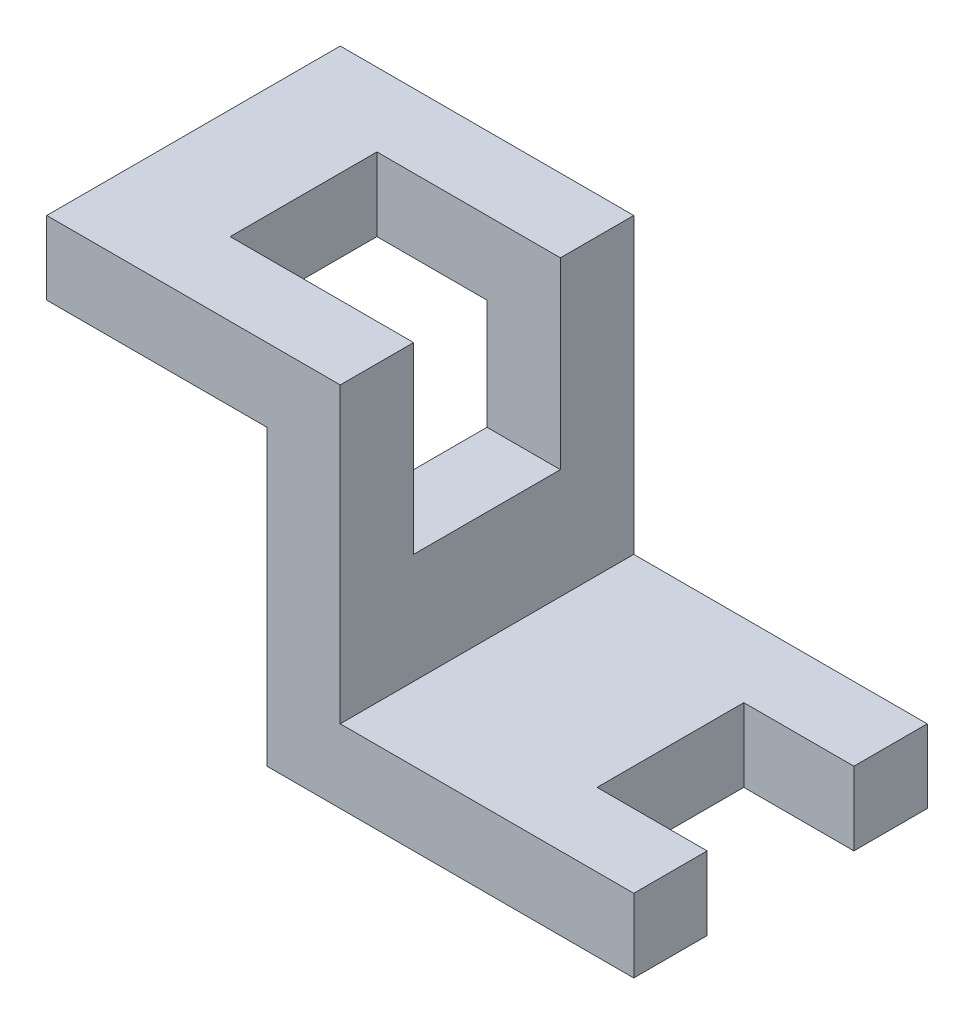
ISO-10303-21;
HEADER;
FILE_DESCRIPTION(('STEP AP214'),'2;1');
FILE_NAME('part.step','',(''),(''),'','','');
FILE_SCHEMA(('AUTOMOTIVE_DESIGN { 1 0 10303 214 1 1 1 1 }'));
ENDSEC;
DATA;
#1=APPLICATION_CONTEXT('core data for automotive mechanical design processes');
#2=APPLICATION_PROTOCOL_DEFINITION('international standard','automotive_design',2000,#1);
#3=PRODUCT_CONTEXT('',#1,'mechanical');
#4=PRODUCT('Part','Part','',(#3));
#5=PRODUCT_RELATED_PRODUCT_CATEGORY('part','',(#4));
#6=PRODUCT_DEFINITION_FORMATION('','',#4);
#7=PRODUCT_DEFINITION_CONTEXT('part definition',#1,'design');
#8=PRODUCT_DEFINITION('design','',#6,#7);
#9=PRODUCT_DEFINITION_SHAPE('','',#8);
#10=(LENGTH_UNIT() NAMED_UNIT(*) SI_UNIT(.MILLI.,.METRE.));
#11=(NAMED_UNIT(*) PLANE_ANGLE_UNIT() SI_UNIT($,.RADIAN.));
#12=(NAMED_UNIT(*) SI_UNIT($,.STERADIAN.) SOLID_ANGLE_UNIT());
#13=UNCERTAINTY_MEASURE_WITH_UNIT(LENGTH_MEASURE(1.E-05),#10,'distance_accuracy_value','');
#14=(GEOMETRIC_REPRESENTATION_CONTEXT(3) GLOBAL_UNCERTAINTY_ASSIGNED_CONTEXT((#13)) GLOBAL_UNIT_ASSIGNED_CONTEXT((#10,
#11,#12)) REPRESENTATION_CONTEXT('',''));
#15=CARTESIAN_POINT('',(0.,0.,0.));
#16=DIRECTION('',(0.,0.,1.));
#17=DIRECTION('',(1.,0.,0.));
#18=AXIS2_PLACEMENT_3D('',#15,#16,#17);
#19=CARTESIAN_POINT('',(40.,-40.,40.));
#20=DIRECTION('',(-1.,0.,0.));
#21=DIRECTION('',(0.,-1.,0.));
#22=AXIS2_PLACEMENT_3D('',#19,#20,#21);
#23=PLANE('',#22);
#24=DIRECTION('',(0.,0.,-1.));
#25=VECTOR('',#24,1.);
#26=CARTESIAN_POINT('',(40.,-50.,40.));
#27=LINE('',#26,#25);
#28=CARTESIAN_POINT('',(40.,-50.,40.));
#29=VERTEX_POINT('',#28);
#30=CARTESIAN_POINT('',(40.,-50.,30.));
#31=VERTEX_POINT('',#30);
#32=EDGE_CURVE('E285',#29,#31,#27,.T.);
#33=ORIENTED_EDGE('',*,*,#32,.T.);
#34=DIRECTION('',(0.,1.,0.));
#35=VECTOR('',#34,1.);
#36=CARTESIAN_POINT('',(40.,-65.,30.));
#37=LINE('',#36,#35);
#38=CARTESIAN_POINT('',(40.,-40.,30.));
#39=VERTEX_POINT('',#38);
#40=EDGE_CURVE('E181',#31,#39,#37,.T.);
#41=ORIENTED_EDGE('',*,*,#40,.T.);
#42=DIRECTION('',(0.,0.,-1.));
#43=VECTOR('',#42,1.);
#44=CARTESIAN_POINT('',(40.,-40.,40.));
#45=LINE('',#44,#43);
#46=CARTESIAN_POINT('',(40.,-40.,40.));
#47=VERTEX_POINT('',#46);
#48=EDGE_CURVE('E282',#47,#39,#45,.T.);
#49=ORIENTED_EDGE('',*,*,#48,.F.);
#50=DIRECTION('',(0.,1.,0.));
#51=VECTOR('',#50,1.);
#52=CARTESIAN_POINT('',(40.,-40.,40.));
#53=LINE('',#52,#51);
#54=EDGE_CURVE('E244',#29,#47,#53,.T.);
#55=ORIENTED_EDGE('',*,*,#54,.F.);
#56=EDGE_LOOP('',(#33,#41,#49,#55));
#57=FACE_BOUND('',#56,.T.);
#58=ADVANCED_FACE('F33',(#57),#23,.F.);
#59=CARTESIAN_POINT('',(-40.,-10.,40.));
#60=DIRECTION('',(1.,0.,0.));
#61=DIRECTION('',(0.,0.,-1.));
#62=AXIS2_PLACEMENT_3D('',#59,#60,#61);
#63=PLANE('',#62);
#64=DIRECTION('',(0.,-1.,0.));
#65=VECTOR('',#64,1.);
#66=CARTESIAN_POINT('',(-40.,-10.,0.));
#67=LINE('',#66,#65);
#68=CARTESIAN_POINT('',(-40.,0.,0.));
#69=VERTEX_POINT('',#68);
#70=CARTESIAN_POINT('',(-40.,-10.,0.));
#71=VERTEX_POINT('',#70);
#72=EDGE_CURVE('E233',#69,#71,#67,.T.);
#73=ORIENTED_EDGE('',*,*,#72,.T.);
#74=DIRECTION('',(0.,0.,-1.));
#75=VECTOR('',#74,1.);
#76=CARTESIAN_POINT('',(-40.,-10.,40.));
#77=LINE('',#76,#75);
#78=CARTESIAN_POINT('',(-40.,-10.,40.));
#79=VERTEX_POINT('',#78);
#80=EDGE_CURVE('E11',#79,#71,#77,.T.);
#81=ORIENTED_EDGE('',*,*,#80,.F.);
#82=DIRECTION('',(0.,-1.,0.));
#83=VECTOR('',#82,1.);
#84=CARTESIAN_POINT('',(-40.,-10.,40.));
#85=LINE('',#84,#83);
#86=CARTESIAN_POINT('',(-40.,0.,40.));
#87=VERTEX_POINT('',#86);
#88=EDGE_CURVE('E234',#87,#79,#85,.T.);
#89=ORIENTED_EDGE('',*,*,#88,.F.);
#90=DIRECTION('',(0.,0.,-1.));
#91=VECTOR('',#90,1.);
#92=CARTESIAN_POINT('',(-40.,0.,40.));
#93=LINE('',#92,#91);
#94=EDGE_CURVE('E252',#87,#69,#93,.T.);
#95=ORIENTED_EDGE('',*,*,#94,.T.);
#96=EDGE_LOOP('',(#73,#81,#89,#95));
#97=FACE_BOUND('',#96,.T.);
#98=ADVANCED_FACE('F35',(#97),#63,.F.);
#99=CARTESIAN_POINT('',(-10.,-10.,40.));
#100=DIRECTION('',(0.,1.,0.));
#101=DIRECTION('',(-1.,0.,0.));
#102=AXIS2_PLACEMENT_3D('',#99,#100,#101);
#103=PLANE('',#102);
#104=DIRECTION('',(0.,0.,-1.));
#105=VECTOR('',#104,1.);
#106=CARTESIAN_POINT('',(-10.,-10.,40.));
#107=LINE('',#106,#105);
#108=CARTESIAN_POINT('',(-10.,-10.,10.));
#109=VERTEX_POINT('',#108);
#110=CARTESIAN_POINT('',(-10.,-10.,0.));
#111=VERTEX_POINT('',#110);
#112=EDGE_CURVE('E290',#109,#111,#107,.T.);
#113=ORIENTED_EDGE('',*,*,#112,.F.);
#114=DIRECTION('',(-1.,0.,0.));
#115=VECTOR('',#114,1.);
#116=CARTESIAN_POINT('',(-10.,-10.,10.));
#117=LINE('',#116,#115);
#118=CARTESIAN_POINT('',(-25.,-10.,10.));
#119=VERTEX_POINT('',#118);
#120=EDGE_CURVE('E227',#109,#119,#117,.T.);
#121=ORIENTED_EDGE('',*,*,#120,.T.);
#122=DIRECTION('',(0.,0.,-1.));
#123=VECTOR('',#122,1.);
#124=CARTESIAN_POINT('',(-25.,-10.,40.));
#125=LINE('',#124,#123);
#126=CARTESIAN_POINT('',(-25.,-10.,30.));
#127=VERTEX_POINT('',#126);
#128=EDGE_CURVE('E212',#127,#119,#125,.T.);
#129=ORIENTED_EDGE('',*,*,#128,.F.);
#130=DIRECTION('',(1.,0.,0.));
#131=VECTOR('',#130,1.);
#132=CARTESIAN_POINT('',(-10.,-10.,30.));
#133=LINE('',#132,#131);
#134=CARTESIAN_POINT('',(-10.,-10.,30.));
#135=VERTEX_POINT('',#134);
#136=EDGE_CURVE('E221',#127,#135,#133,.T.);
#137=ORIENTED_EDGE('',*,*,#136,.T.);
#138=CARTESIAN_POINT('',(-10.,-10.,40.));
#139=VERTEX_POINT('',#138);
#140=EDGE_CURVE('E41',#139,#135,#107,.T.);
#141=ORIENTED_EDGE('',*,*,#140,.F.);
#142=DIRECTION('',(1.,0.,0.));
#143=VECTOR('',#142,1.);
#144=CARTESIAN_POINT('',(-10.,-10.,40.));
#145=LINE('',#144,#143);
#146=EDGE_CURVE('E237',#79,#139,#145,.T.);
#147=ORIENTED_EDGE('',*,*,#146,.F.);
#148=ORIENTED_EDGE('',*,*,#80,.T.);
#149=DIRECTION('',(1.,0.,0.));
#150=VECTOR('',#149,1.);
#151=CARTESIAN_POINT('',(-10.,-10.,0.));
#152=LINE('',#151,#150);
#153=EDGE_CURVE('E255',#71,#111,#152,.T.);
#154=ORIENTED_EDGE('',*,*,#153,.T.);
#155=EDGE_LOOP('',(#113,#121,#129,#137,#141,#147,#148,#154));
#156=FACE_BOUND('',#155,.T.);
#157=ADVANCED_FACE('F300',(#156),#103,.F.);
#158=CARTESIAN_POINT('',(-10.,-50.,40.));
#159=DIRECTION('',(1.,0.,0.));
#160=DIRECTION('',(0.,1.,0.));
#161=AXIS2_PLACEMENT_3D('',#158,#159,#160);
#162=PLANE('',#161);
#163=DIRECTION('',(0.,0.,-1.));
#164=VECTOR('',#163,1.);
#165=CARTESIAN_POINT('',(-10.,-25.,40.));
#166=LINE('',#165,#164);
#167=CARTESIAN_POINT('',(-10.,-25.,30.));
#168=VERTEX_POINT('',#167);
#169=CARTESIAN_POINT('',(-10.,-25.,10.));
#170=VERTEX_POINT('',#169);
#171=EDGE_CURVE('E230',#168,#170,#166,.T.);
#172=ORIENTED_EDGE('',*,*,#171,.T.);
#173=DIRECTION('',(0.,1.,0.));
#174=VECTOR('',#173,1.);
#175=CARTESIAN_POINT('',(-10.,-50.,10.));
#176=LINE('',#175,#174);
#177=EDGE_CURVE('E224',#170,#109,#176,.T.);
#178=ORIENTED_EDGE('',*,*,#177,.T.);
#179=ORIENTED_EDGE('',*,*,#112,.T.);
#180=DIRECTION('',(0.,-1.,0.));
#181=VECTOR('',#180,1.);
#182=CARTESIAN_POINT('',(-10.,-50.,0.));
#183=LINE('',#182,#181);
#184=CARTESIAN_POINT('',(-10.,-50.,0.));
#185=VERTEX_POINT('',#184);
#186=EDGE_CURVE('E258',#111,#185,#183,.T.);
#187=ORIENTED_EDGE('',*,*,#186,.T.);
#188=DIRECTION('',(0.,0.,-1.));
#189=VECTOR('',#188,1.);
#190=CARTESIAN_POINT('',(-10.,-50.,40.));
#191=LINE('',#190,#189);
#192=CARTESIAN_POINT('',(-10.,-50.,40.));
#193=VERTEX_POINT('',#192);
#194=EDGE_CURVE('E288',#193,#185,#191,.T.);
#195=ORIENTED_EDGE('',*,*,#194,.F.);
#196=DIRECTION('',(0.,-1.,0.));
#197=VECTOR('',#196,1.);
#198=CARTESIAN_POINT('',(-10.,-50.,40.));
#199=LINE('',#198,#197);
#200=EDGE_CURVE('E240',#139,#193,#199,.T.);
#201=ORIENTED_EDGE('',*,*,#200,.F.);
#202=ORIENTED_EDGE('',*,*,#140,.T.);
#203=DIRECTION('',(0.,-1.,0.));
#204=VECTOR('',#203,1.);
#205=CARTESIAN_POINT('',(-10.,-50.,30.));
#206=LINE('',#205,#204);
#207=EDGE_CURVE('E218',#135,#168,#206,.T.);
#208=ORIENTED_EDGE('',*,*,#207,.T.);
#209=EDGE_LOOP('',(#172,#178,#179,#187,#195,#201,#202,#208));
#210=FACE_BOUND('',#209,.T.);
#211=ADVANCED_FACE('F296',(#210),#162,.F.);
#212=CARTESIAN_POINT('',(40.,-50.,40.));
#213=DIRECTION('',(0.,1.,0.));
#214=DIRECTION('',(0.,0.,1.));
#215=AXIS2_PLACEMENT_3D('',#212,#213,#214);
#216=PLANE('',#215);
#217=DIRECTION('',(0.,0.,1.));
#218=VECTOR('',#217,1.);
#219=CARTESIAN_POINT('',(25.,-50.,40.));
#220=LINE('',#219,#218);
#221=CARTESIAN_POINT('',(25.,-50.,10.));
#222=VERTEX_POINT('',#221);
#223=CARTESIAN_POINT('',(25.,-50.,30.));
#224=VERTEX_POINT('',#223);
#225=EDGE_CURVE('E166',#222,#224,#220,.T.);
#226=ORIENTED_EDGE('',*,*,#225,.T.);
#227=DIRECTION('',(1.,0.,0.));
#228=VECTOR('',#227,1.);
#229=CARTESIAN_POINT('',(40.,-50.,30.));
#230=LINE('',#229,#228);
#231=EDGE_CURVE('E189',#224,#31,#230,.T.);
#232=ORIENTED_EDGE('',*,*,#231,.T.);
#233=ORIENTED_EDGE('',*,*,#32,.F.);
#234=DIRECTION('',(1.,0.,0.));
#235=VECTOR('',#234,1.);
#236=CARTESIAN_POINT('',(40.,-50.,40.));
#237=LINE('',#236,#235);
#238=EDGE_CURVE('E242',#193,#29,#237,.T.);
#239=ORIENTED_EDGE('',*,*,#238,.F.);
#240=ORIENTED_EDGE('',*,*,#194,.T.);
#241=DIRECTION('',(1.,0.,0.));
#242=VECTOR('',#241,1.);
#243=CARTESIAN_POINT('',(40.,-50.,0.));
#244=LINE('',#243,#242);
#245=CARTESIAN_POINT('',(40.,-50.,0.));
#246=VERTEX_POINT('',#245);
#247=EDGE_CURVE('E260',#185,#246,#244,.T.);
#248=ORIENTED_EDGE('',*,*,#247,.T.);
#249=CARTESIAN_POINT('',(40.,-50.,10.));
#250=VERTEX_POINT('',#249);
#251=EDGE_CURVE('E284',#250,#246,#27,.T.);
#252=ORIENTED_EDGE('',*,*,#251,.F.);
#253=DIRECTION('',(-1.,0.,0.));
#254=VECTOR('',#253,1.);
#255=CARTESIAN_POINT('',(40.,-50.,10.));
#256=LINE('',#255,#254);
#257=EDGE_CURVE('E184',#250,#222,#256,.T.);
#258=ORIENTED_EDGE('',*,*,#257,.T.);
#259=EDGE_LOOP('',(#226,#232,#233,#239,#240,#248,#252,#258));
#260=FACE_BOUND('',#259,.T.);
#261=ADVANCED_FACE('F310',(#260),#216,.F.);
#262=CARTESIAN_POINT('',(40.,-40.,10.));
#263=VERTEX_POINT('',#262);
#264=CARTESIAN_POINT('',(40.,-40.,0.));
#265=VERTEX_POINT('',#264);
#266=EDGE_CURVE('E281',#263,#265,#45,.T.);
#267=ORIENTED_EDGE('',*,*,#266,.F.);
#268=DIRECTION('',(0.,1.,0.));
#269=VECTOR('',#268,1.);
#270=CARTESIAN_POINT('',(40.,-65.,10.));
#271=LINE('',#270,#269);
#272=EDGE_CURVE('E48',#250,#263,#271,.T.);
#273=ORIENTED_EDGE('',*,*,#272,.F.);
#274=ORIENTED_EDGE('',*,*,#251,.T.);
#275=DIRECTION('',(0.,1.,0.));
#276=VECTOR('',#275,1.);
#277=CARTESIAN_POINT('',(40.,-40.,0.));
#278=LINE('',#277,#276);
#279=EDGE_CURVE('E263',#246,#265,#278,.T.);
#280=ORIENTED_EDGE('',*,*,#279,.T.);
#281=EDGE_LOOP('',(#267,#273,#274,#280));
#282=FACE_BOUND('',#281,.T.);
#283=ADVANCED_FACE('F351',(#282),#23,.F.);
#284=CARTESIAN_POINT('',(0.,-40.,40.));
#285=DIRECTION('',(0.,-1.,0.));
#286=DIRECTION('',(0.,0.,-1.));
#287=AXIS2_PLACEMENT_3D('',#284,#285,#286);
#288=PLANE('',#287);
#289=ORIENTED_EDGE('',*,*,#48,.T.);
#290=DIRECTION('',(1.,0.,0.));
#291=VECTOR('',#290,1.);
#292=CARTESIAN_POINT('',(25.,-40.,30.));
#293=LINE('',#292,#291);
#294=CARTESIAN_POINT('',(25.,-40.,30.));
#295=VERTEX_POINT('',#294);
#296=EDGE_CURVE('E177',#295,#39,#293,.T.);
#297=ORIENTED_EDGE('',*,*,#296,.F.);
#298=DIRECTION('',(0.,0.,1.));
#299=VECTOR('',#298,1.);
#300=CARTESIAN_POINT('',(25.,-40.,10.));
#301=LINE('',#300,#299);
#302=CARTESIAN_POINT('',(25.,-40.,10.));
#303=VERTEX_POINT('',#302);
#304=EDGE_CURVE('E163',#303,#295,#301,.T.);
#305=ORIENTED_EDGE('',*,*,#304,.F.);
#306=DIRECTION('',(-1.,0.,0.));
#307=VECTOR('',#306,1.);
#308=CARTESIAN_POINT('',(40.,-40.,10.));
#309=LINE('',#308,#307);
#310=EDGE_CURVE('E170',#263,#303,#309,.T.);
#311=ORIENTED_EDGE('',*,*,#310,.F.);
#312=ORIENTED_EDGE('',*,*,#266,.T.);
#313=DIRECTION('',(-1.,0.,0.));
#314=VECTOR('',#313,1.);
#315=CARTESIAN_POINT('',(0.,-40.,0.));
#316=LINE('',#315,#314);
#317=CARTESIAN_POINT('',(0.,-40.,0.));
#318=VERTEX_POINT('',#317);
#319=EDGE_CURVE('E266',#265,#318,#316,.T.);
#320=ORIENTED_EDGE('',*,*,#319,.T.);
#321=DIRECTION('',(0.,0.,-1.));
#322=VECTOR('',#321,1.);
#323=CARTESIAN_POINT('',(0.,-40.,40.));
#324=LINE('',#323,#322);
#325=CARTESIAN_POINT('',(0.,-40.,40.));
#326=VERTEX_POINT('',#325);
#327=EDGE_CURVE('E278',#326,#318,#324,.T.);
#328=ORIENTED_EDGE('',*,*,#327,.F.);
#329=DIRECTION('',(-1.,0.,0.));
#330=VECTOR('',#329,1.);
#331=CARTESIAN_POINT('',(0.,-40.,40.));
#332=LINE('',#331,#330);
#333=EDGE_CURVE('E246',#47,#326,#332,.T.);
#334=ORIENTED_EDGE('',*,*,#333,.F.);
#335=EDGE_LOOP('',(#289,#297,#305,#311,#312,#320,#328,#334));
#336=FACE_BOUND('',#335,.T.);
#337=ADVANCED_FACE('F176',(#336),#288,.F.);
#338=CARTESIAN_POINT('',(0.,0.,40.));
#339=DIRECTION('',(-1.,0.,0.));
#340=DIRECTION('',(0.,-1.,0.));
#341=AXIS2_PLACEMENT_3D('',#338,#339,#340);
#342=PLANE('',#341);
#343=DIRECTION('',(0.,0.,-1.));
#344=VECTOR('',#343,1.);
#345=CARTESIAN_POINT('',(0.,0.,40.));
#346=LINE('',#345,#344);
#347=CARTESIAN_POINT('',(0.,0.,10.));
#348=VERTEX_POINT('',#347);
#349=CARTESIAN_POINT('',(0.,0.,0.));
#350=VERTEX_POINT('',#349);
#351=EDGE_CURVE('E274',#348,#350,#346,.T.);
#352=ORIENTED_EDGE('',*,*,#351,.F.);
#353=DIRECTION('',(0.,1.,0.));
#354=VECTOR('',#353,1.);
#355=CARTESIAN_POINT('',(0.,-25.,10.));
#356=LINE('',#355,#354);
#357=CARTESIAN_POINT('',(0.,-25.,10.));
#358=VERTEX_POINT('',#357);
#359=EDGE_CURVE('E197',#358,#348,#356,.T.);
#360=ORIENTED_EDGE('',*,*,#359,.F.);
#361=DIRECTION('',(0.,0.,-1.));
#362=VECTOR('',#361,1.);
#363=CARTESIAN_POINT('',(0.,-25.,30.));
#364=LINE('',#363,#362);
#365=CARTESIAN_POINT('',(0.,-25.,30.));
#366=VERTEX_POINT('',#365);
#367=EDGE_CURVE('E205',#366,#358,#364,.T.);
#368=ORIENTED_EDGE('',*,*,#367,.F.);
#369=DIRECTION('',(0.,-1.,0.));
#370=VECTOR('',#369,1.);
#371=CARTESIAN_POINT('',(0.,0.,30.));
#372=LINE('',#371,#370);
#373=CARTESIAN_POINT('',(0.,0.,30.));
#374=VERTEX_POINT('',#373);
#375=EDGE_CURVE('E192',#374,#366,#372,.T.);
#376=ORIENTED_EDGE('',*,*,#375,.F.);
#377=CARTESIAN_POINT('',(0.,0.,40.));
#378=VERTEX_POINT('',#377);
#379=EDGE_CURVE('E275',#378,#374,#346,.T.);
#380=ORIENTED_EDGE('',*,*,#379,.F.);
#381=DIRECTION('',(0.,1.,0.));
#382=VECTOR('',#381,1.);
#383=CARTESIAN_POINT('',(0.,0.,40.));
#384=LINE('',#383,#382);
#385=EDGE_CURVE('E248',#326,#378,#384,.T.);
#386=ORIENTED_EDGE('',*,*,#385,.F.);
#387=ORIENTED_EDGE('',*,*,#327,.T.);
#388=DIRECTION('',(0.,1.,0.));
#389=VECTOR('',#388,1.);
#390=CARTESIAN_POINT('',(0.,0.,0.));
#391=LINE('',#390,#389);
#392=EDGE_CURVE('E268',#318,#350,#391,.T.);
#393=ORIENTED_EDGE('',*,*,#392,.T.);
#394=EDGE_LOOP('',(#352,#360,#368,#376,#380,#386,#387,#393));
#395=FACE_BOUND('',#394,.T.);
#396=ADVANCED_FACE('F331',(#395),#342,.F.);
#397=CARTESIAN_POINT('',(-40.,0.,40.));
#398=DIRECTION('',(0.,-1.,0.));
#399=DIRECTION('',(0.,0.,-1.));
#400=AXIS2_PLACEMENT_3D('',#397,#398,#399);
#401=PLANE('',#400);
#402=DIRECTION('',(0.,0.,1.));
#403=VECTOR('',#402,1.);
#404=CARTESIAN_POINT('',(-25.,0.,30.));
#405=LINE('',#404,#403);
#406=CARTESIAN_POINT('',(-25.,0.,10.));
#407=VERTEX_POINT('',#406);
#408=CARTESIAN_POINT('',(-25.,0.,30.));
#409=VERTEX_POINT('',#408);
#410=EDGE_CURVE('E193',#407,#409,#405,.T.);
#411=ORIENTED_EDGE('',*,*,#410,.F.);
#412=DIRECTION('',(1.,0.,0.));
#413=VECTOR('',#412,1.);
#414=CARTESIAN_POINT('',(-25.,0.,10.));
#415=LINE('',#414,#413);
#416=EDGE_CURVE('E209',#407,#348,#415,.T.);
#417=ORIENTED_EDGE('',*,*,#416,.T.);
#418=ORIENTED_EDGE('',*,*,#351,.T.);
#419=DIRECTION('',(-1.,0.,0.));
#420=VECTOR('',#419,1.);
#421=CARTESIAN_POINT('',(-40.,0.,0.));
#422=LINE('',#421,#420);
#423=EDGE_CURVE('E238',#350,#69,#422,.T.);
#424=ORIENTED_EDGE('',*,*,#423,.T.);
#425=ORIENTED_EDGE('',*,*,#94,.F.);
#426=DIRECTION('',(-1.,0.,0.));
#427=VECTOR('',#426,1.);
#428=CARTESIAN_POINT('',(-40.,0.,40.));
#429=LINE('',#428,#427);
#430=EDGE_CURVE('E250',#378,#87,#429,.T.);
#431=ORIENTED_EDGE('',*,*,#430,.F.);
#432=ORIENTED_EDGE('',*,*,#379,.T.);
#433=DIRECTION('',(1.,0.,0.));
#434=VECTOR('',#433,1.);
#435=CARTESIAN_POINT('',(-25.,0.,30.));
#436=LINE('',#435,#434);
#437=EDGE_CURVE('E203',#409,#374,#436,.T.);
#438=ORIENTED_EDGE('',*,*,#437,.F.);
#439=EDGE_LOOP('',(#411,#417,#418,#424,#425,#431,#432,#438));
#440=FACE_BOUND('',#439,.T.);
#441=ADVANCED_FACE('F324',(#440),#401,.F.);
#442=CARTESIAN_POINT('',(0.,0.,40.));
#443=DIRECTION('',(0.,0.,-1.));
#444=DIRECTION('',(-1.,0.,0.));
#445=AXIS2_PLACEMENT_3D('',#442,#443,#444);
#446=PLANE('',#445);
#447=ORIENTED_EDGE('',*,*,#88,.T.);
#448=ORIENTED_EDGE('',*,*,#146,.T.);
#449=ORIENTED_EDGE('',*,*,#200,.T.);
#450=ORIENTED_EDGE('',*,*,#238,.T.);
#451=ORIENTED_EDGE('',*,*,#54,.T.);
#452=ORIENTED_EDGE('',*,*,#333,.T.);
#453=ORIENTED_EDGE('',*,*,#385,.T.);
#454=ORIENTED_EDGE('',*,*,#430,.T.);
#455=EDGE_LOOP('',(#447,#448,#449,#450,#451,#452,#453,#454));
#456=FACE_BOUND('',#455,.T.);
#457=ADVANCED_FACE('F314',(#456),#446,.F.);
#458=CARTESIAN_POINT('',(0.,0.,0.));
#459=DIRECTION('',(0.,0.,-1.));
#460=DIRECTION('',(-1.,0.,0.));
#461=AXIS2_PLACEMENT_3D('',#458,#459,#460);
#462=PLANE('',#461);
#463=ORIENTED_EDGE('',*,*,#72,.F.);
#464=ORIENTED_EDGE('',*,*,#423,.F.);
#465=ORIENTED_EDGE('',*,*,#392,.F.);
#466=ORIENTED_EDGE('',*,*,#319,.F.);
#467=ORIENTED_EDGE('',*,*,#279,.F.);
#468=ORIENTED_EDGE('',*,*,#247,.F.);
#469=ORIENTED_EDGE('',*,*,#186,.F.);
#470=ORIENTED_EDGE('',*,*,#153,.F.);
#471=EDGE_LOOP('',(#463,#464,#465,#466,#467,#468,#469,#470));
#472=FACE_BOUND('',#471,.T.);
#473=ADVANCED_FACE('F305',(#472),#462,.T.);
#474=CARTESIAN_POINT('',(-25.,-25.,30.));
#475=DIRECTION('',(0.,-1.,0.));
#476=DIRECTION('',(1.,0.,0.));
#477=AXIS2_PLACEMENT_3D('',#474,#475,#476);
#478=PLANE('',#477);
#479=DIRECTION('',(1.,0.,0.));
#480=VECTOR('',#479,1.);
#481=CARTESIAN_POINT('',(-25.,-25.,30.));
#482=LINE('',#481,#480);
#483=EDGE_CURVE('E56',#168,#366,#482,.T.);
#484=ORIENTED_EDGE('',*,*,#483,.T.);
#485=ORIENTED_EDGE('',*,*,#367,.T.);
#486=DIRECTION('',(1.,0.,0.));
#487=VECTOR('',#486,1.);
#488=CARTESIAN_POINT('',(-25.,-25.,10.));
#489=LINE('',#488,#487);
#490=EDGE_CURVE('E213',#170,#358,#489,.T.);
#491=ORIENTED_EDGE('',*,*,#490,.F.);
#492=ORIENTED_EDGE('',*,*,#171,.F.);
#493=EDGE_LOOP('',(#484,#485,#491,#492));
#494=FACE_BOUND('',#493,.T.);
#495=ADVANCED_FACE('F336',(#494),#478,.F.);
#496=CARTESIAN_POINT('',(-25.,-25.,10.));
#497=DIRECTION('',(0.,0.,-1.));
#498=DIRECTION('',(-1.,0.,0.));
#499=AXIS2_PLACEMENT_3D('',#496,#497,#498);
#500=PLANE('',#499);
#501=ORIENTED_EDGE('',*,*,#177,.F.);
#502=ORIENTED_EDGE('',*,*,#490,.T.);
#503=ORIENTED_EDGE('',*,*,#359,.T.);
#504=ORIENTED_EDGE('',*,*,#416,.F.);
#505=DIRECTION('',(0.,1.,0.));
#506=VECTOR('',#505,1.);
#507=CARTESIAN_POINT('',(-25.,-25.,10.));
#508=LINE('',#507,#506);
#509=EDGE_CURVE('E200',#119,#407,#508,.T.);
#510=ORIENTED_EDGE('',*,*,#509,.F.);
#511=ORIENTED_EDGE('',*,*,#120,.F.);
#512=EDGE_LOOP('',(#501,#502,#503,#504,#510,#511));
#513=FACE_BOUND('',#512,.T.);
#514=ADVANCED_FACE('F338',(#513),#500,.F.);
#515=CARTESIAN_POINT('',(-25.,0.,30.));
#516=DIRECTION('',(0.,0.,1.));
#517=DIRECTION('',(0.,-1.,0.));
#518=AXIS2_PLACEMENT_3D('',#515,#516,#517);
#519=PLANE('',#518);
#520=DIRECTION('',(0.,-1.,0.));
#521=VECTOR('',#520,1.);
#522=CARTESIAN_POINT('',(-25.,0.,30.));
#523=LINE('',#522,#521);
#524=EDGE_CURVE('E196',#409,#127,#523,.T.);
#525=ORIENTED_EDGE('',*,*,#524,.F.);
#526=ORIENTED_EDGE('',*,*,#437,.T.);
#527=ORIENTED_EDGE('',*,*,#375,.T.);
#528=ORIENTED_EDGE('',*,*,#483,.F.);
#529=ORIENTED_EDGE('',*,*,#207,.F.);
#530=ORIENTED_EDGE('',*,*,#136,.F.);
#531=EDGE_LOOP('',(#525,#526,#527,#528,#529,#530));
#532=FACE_BOUND('',#531,.T.);
#533=ADVANCED_FACE('F317',(#532),#519,.F.);
#534=CARTESIAN_POINT('',(-25.,0.,0.));
#535=DIRECTION('',(1.,0.,0.));
#536=DIRECTION('',(0.,1.,0.));
#537=AXIS2_PLACEMENT_3D('',#534,#535,#536);
#538=PLANE('',#537);
#539=ORIENTED_EDGE('',*,*,#128,.T.);
#540=ORIENTED_EDGE('',*,*,#509,.T.);
#541=ORIENTED_EDGE('',*,*,#410,.T.);
#542=ORIENTED_EDGE('',*,*,#524,.T.);
#543=EDGE_LOOP('',(#539,#540,#541,#542));
#544=FACE_BOUND('',#543,.T.);
#545=ADVANCED_FACE('F319',(#544),#538,.T.);
#546=CARTESIAN_POINT('',(25.,-65.,30.));
#547=DIRECTION('',(0.,0.,1.));
#548=DIRECTION('',(1.,0.,0.));
#549=AXIS2_PLACEMENT_3D('',#546,#547,#548);
#550=PLANE('',#549);
#551=DIRECTION('',(0.,1.,0.));
#552=VECTOR('',#551,1.);
#553=CARTESIAN_POINT('',(25.,-65.,30.));
#554=LINE('',#553,#552);
#555=EDGE_CURVE('E168',#224,#295,#554,.T.);
#556=ORIENTED_EDGE('',*,*,#555,.T.);
#557=ORIENTED_EDGE('',*,*,#296,.T.);
#558=ORIENTED_EDGE('',*,*,#40,.F.);
#559=ORIENTED_EDGE('',*,*,#231,.F.);
#560=EDGE_LOOP('',(#556,#557,#558,#559));
#561=FACE_BOUND('',#560,.T.);
#562=ADVANCED_FACE('F366',(#561),#550,.F.);
#563=CARTESIAN_POINT('',(25.,-65.,10.));
#564=DIRECTION('',(-1.,0.,0.));
#565=DIRECTION('',(0.,0.,1.));
#566=AXIS2_PLACEMENT_3D('',#563,#564,#565);
#567=PLANE('',#566);
#568=DIRECTION('',(0.,1.,0.));
#569=VECTOR('',#568,1.);
#570=CARTESIAN_POINT('',(25.,-65.,10.));
#571=LINE('',#570,#569);
#572=EDGE_CURVE('E159',#222,#303,#571,.T.);
#573=ORIENTED_EDGE('',*,*,#572,.T.);
#574=ORIENTED_EDGE('',*,*,#304,.T.);
#575=ORIENTED_EDGE('',*,*,#555,.F.);
#576=ORIENTED_EDGE('',*,*,#225,.F.);
#577=EDGE_LOOP('',(#573,#574,#575,#576));
#578=FACE_BOUND('',#577,.T.);
#579=ADVANCED_FACE('F160',(#578),#567,.F.);
#580=CARTESIAN_POINT('',(40.,-65.,10.));
#581=DIRECTION('',(0.,0.,-1.));
#582=DIRECTION('',(-1.,0.,0.));
#583=AXIS2_PLACEMENT_3D('',#580,#581,#582);
#584=PLANE('',#583);
#585=ORIENTED_EDGE('',*,*,#272,.T.);
#586=ORIENTED_EDGE('',*,*,#310,.T.);
#587=ORIENTED_EDGE('',*,*,#572,.F.);
#588=ORIENTED_EDGE('',*,*,#257,.F.);
#589=EDGE_LOOP('',(#585,#586,#587,#588));
#590=FACE_BOUND('',#589,.T.);
#591=ADVANCED_FACE('F171',(#590),#584,.F.);
#592=CLOSED_SHELL('',(#58,#98,#157,#211,#261,#283,#337,#396,#441,#457,#473,#495,#514,#533,#545,
#562,#579,#591));
#593=MANIFOLD_SOLID_BREP('B2',#592);
#594=ADVANCED_BREP_SHAPE_REPRESENTATION('',(#18,#593),#14);
#595=SHAPE_DEFINITION_REPRESENTATION(#9,#594);
ENDSEC;
END-ISO-10303-21;
